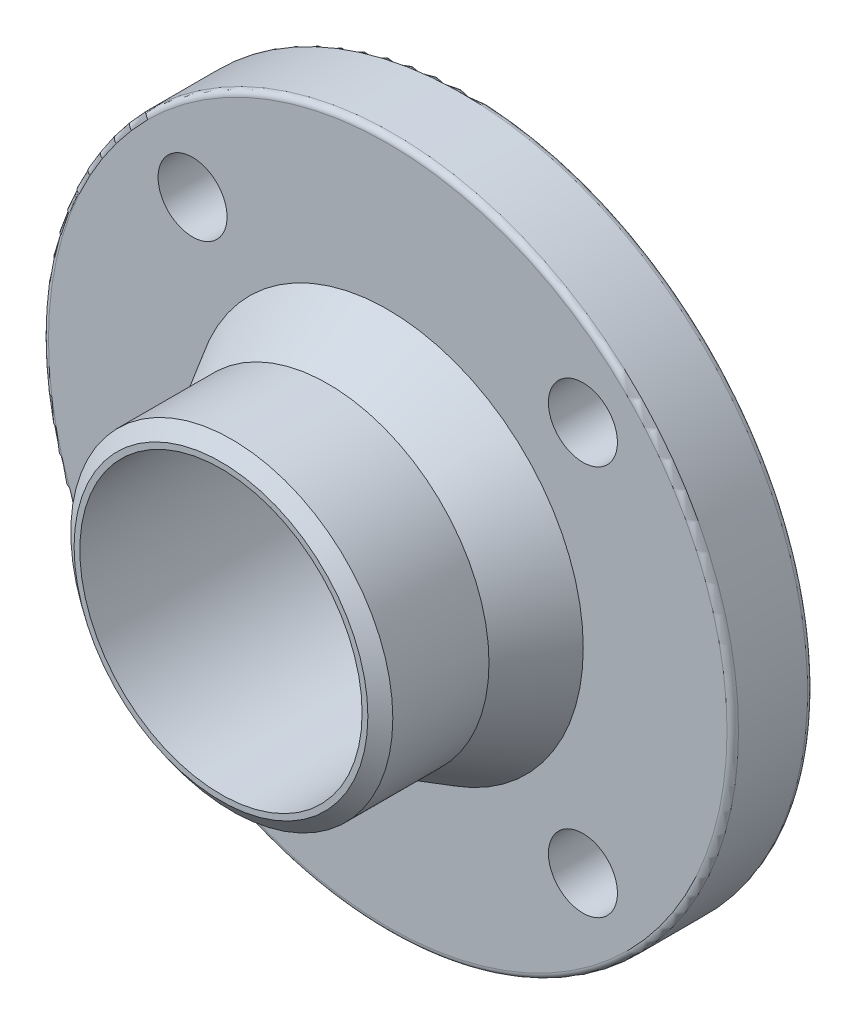
ISO-10303-21;
HEADER;
FILE_DESCRIPTION(('STEP AP214'),'2;1');
FILE_NAME('part.step','',(''),(''),'','','');
FILE_SCHEMA(('AUTOMOTIVE_DESIGN { 1 0 10303 214 1 1 1 1 }'));
ENDSEC;
DATA;
#1=APPLICATION_CONTEXT('core data for automotive mechanical design processes');
#2=APPLICATION_PROTOCOL_DEFINITION('international standard','automotive_design',2000,#1);
#3=PRODUCT_CONTEXT('',#1,'mechanical');
#4=PRODUCT('Part','Part','',(#3));
#5=PRODUCT_RELATED_PRODUCT_CATEGORY('part','',(#4));
#6=PRODUCT_DEFINITION_FORMATION('','',#4);
#7=PRODUCT_DEFINITION_CONTEXT('part definition',#1,'design');
#8=PRODUCT_DEFINITION('design','',#6,#7);
#9=PRODUCT_DEFINITION_SHAPE('','',#8);
#10=(LENGTH_UNIT() NAMED_UNIT(*) SI_UNIT(.MILLI.,.METRE.));
#11=(NAMED_UNIT(*) PLANE_ANGLE_UNIT() SI_UNIT($,.RADIAN.));
#12=(NAMED_UNIT(*) SI_UNIT($,.STERADIAN.) SOLID_ANGLE_UNIT());
#13=UNCERTAINTY_MEASURE_WITH_UNIT(LENGTH_MEASURE(1.E-05),#10,'distance_accuracy_value','');
#14=(GEOMETRIC_REPRESENTATION_CONTEXT(3) GLOBAL_UNCERTAINTY_ASSIGNED_CONTEXT((#13)) GLOBAL_UNIT_ASSIGNED_CONTEXT((#10,
#11,#12)) REPRESENTATION_CONTEXT('',''));
#15=CARTESIAN_POINT('',(0.,0.,0.));
#16=DIRECTION('',(0.,0.,1.));
#17=DIRECTION('',(1.,0.,0.));
#18=AXIS2_PLACEMENT_3D('',#15,#16,#17);
#19=CARTESIAN_POINT('',(0.,0.,0.));
#20=DIRECTION('',(0.,0.,1.));
#21=DIRECTION('',(1.,0.,0.));
#22=AXIS2_PLACEMENT_3D('',#19,#20,#21);
#23=PLANE('',#22);
#24=CARTESIAN_POINT('',(0.,0.,0.));
#25=DIRECTION('',(0.,0.,-1.));
#26=DIRECTION('',(-1.,0.,0.));
#27=AXIS2_PLACEMENT_3D('',#24,#25,#26);
#28=CIRCLE('',#27,63.5);
#29=CARTESIAN_POINT('',(-63.5,0.,0.));
#30=VERTEX_POINT('',#29);
#31=EDGE_CURVE('E84',#30,#30,#28,.T.);
#32=ORIENTED_EDGE('',*,*,#31,.T.);
#33=EDGE_LOOP('',(#32));
#34=FACE_BOUND('',#33,.T.);
#35=CARTESIAN_POINT('',(0.,0.,0.));
#36=DIRECTION('',(0.,0.,1.));
#37=DIRECTION('',(1.,0.,0.));
#38=AXIS2_PLACEMENT_3D('',#35,#36,#37);
#39=CIRCLE('',#38,38.9636);
#40=CARTESIAN_POINT('',(38.9636,0.,0.));
#41=VERTEX_POINT('',#40);
#42=EDGE_CURVE('E120',#41,#41,#39,.T.);
#43=ORIENTED_EDGE('',*,*,#42,.T.);
#44=EDGE_LOOP('',(#43));
#45=FACE_BOUND('',#44,.T.);
#46=ADVANCED_FACE('F39',(#34,#45),#23,.F.);
#47=CARTESIAN_POINT('',(0.,0.,69.85));
#48=DIRECTION('',(0.,0.,1.));
#49=DIRECTION('',(1.,0.,0.));
#50=AXIS2_PLACEMENT_3D('',#47,#48,#49);
#51=PLANE('',#50);
#52=CARTESIAN_POINT('',(0.,0.,69.85));
#53=DIRECTION('',(0.,0.,1.));
#54=DIRECTION('',(1.,0.,0.));
#55=AXIS2_PLACEMENT_3D('',#52,#53,#54);
#56=CIRCLE('',#55,40.5510999999567);
#57=CARTESIAN_POINT('',(40.5510999999567,0.,69.85));
#58=VERTEX_POINT('',#57);
#59=EDGE_CURVE('E74',#58,#58,#56,.T.);
#60=ORIENTED_EDGE('',*,*,#59,.T.);
#61=EDGE_LOOP('',(#60));
#62=FACE_BOUND('',#61,.T.);
#63=CARTESIAN_POINT('',(0.,0.,69.85));
#64=DIRECTION('',(0.,0.,1.));
#65=DIRECTION('',(1.,0.,0.));
#66=AXIS2_PLACEMENT_3D('',#63,#64,#65);
#67=CIRCLE('',#66,38.9636);
#68=CARTESIAN_POINT('',(38.9636,0.,69.85));
#69=VERTEX_POINT('',#68);
#70=EDGE_CURVE('E119',#69,#69,#67,.T.);
#71=ORIENTED_EDGE('',*,*,#70,.F.);
#72=EDGE_LOOP('',(#71));
#73=FACE_BOUND('',#72,.T.);
#74=ADVANCED_FACE('F131',(#62,#73),#51,.T.);
#75=CARTESIAN_POINT('',(0.,0.,23.8125));
#76=DIRECTION('',(0.,0.,1.));
#77=DIRECTION('',(1.,0.,0.));
#78=AXIS2_PLACEMENT_3D('',#75,#76,#77);
#79=PLANE('',#78);
#80=CARTESIAN_POINT('',(0.,0.,23.8125));
#81=DIRECTION('',(0.,0.,1.));
#82=DIRECTION('',(1.,0.,0.));
#83=AXIS2_PLACEMENT_3D('',#80,#81,#82);
#84=CIRCLE('',#83,93.6625);
#85=CARTESIAN_POINT('',(93.6625,0.,23.8125));
#86=VERTEX_POINT('',#85);
#87=EDGE_CURVE('E47',#86,#86,#84,.T.);
#88=ORIENTED_EDGE('',*,*,#87,.T.);
#89=EDGE_LOOP('',(#88));
#90=FACE_BOUND('',#89,.T.);
#91=CARTESIAN_POINT('',(53.8815367264154,-53.8815367264144,23.8125));
#92=DIRECTION('',(0.,0.,1.));
#93=DIRECTION('',(0.,-1.,0.));
#94=AXIS2_PLACEMENT_3D('',#91,#92,#93);
#95=CIRCLE('',#94,9.52500000000001);
#96=CARTESIAN_POINT('',(53.8815367264155,-63.4065367264144,23.8125));
#97=VERTEX_POINT('',#96);
#98=EDGE_CURVE('E95',#97,#97,#95,.T.);
#99=ORIENTED_EDGE('',*,*,#98,.F.);
#100=EDGE_LOOP('',(#99));
#101=FACE_BOUND('',#100,.T.);
#102=CARTESIAN_POINT('',(-53.881536726415,53.8815367264148,23.8125));
#103=DIRECTION('',(0.,0.,1.));
#104=DIRECTION('',(0.,1.,0.));
#105=AXIS2_PLACEMENT_3D('',#102,#103,#104);
#106=CIRCLE('',#105,9.52500000000001);
#107=CARTESIAN_POINT('',(-53.8815367264151,63.4065367264148,23.8125));
#108=VERTEX_POINT('',#107);
#109=EDGE_CURVE('E88',#108,#108,#106,.T.);
#110=ORIENTED_EDGE('',*,*,#109,.F.);
#111=EDGE_LOOP('',(#110));
#112=FACE_BOUND('',#111,.T.);
#113=CARTESIAN_POINT('',(53.881536726415,53.8815367264149,23.8125));
#114=DIRECTION('',(0.,0.,1.));
#115=DIRECTION('',(1.,0.,0.));
#116=AXIS2_PLACEMENT_3D('',#113,#114,#115);
#117=CIRCLE('',#116,9.52500000000001);
#118=CARTESIAN_POINT('',(63.406536726415,53.8815367264149,23.8125));
#119=VERTEX_POINT('',#118);
#120=EDGE_CURVE('E78',#119,#119,#117,.T.);
#121=ORIENTED_EDGE('',*,*,#120,.F.);
#122=EDGE_LOOP('',(#121));
#123=FACE_BOUND('',#122,.T.);
#124=CARTESIAN_POINT('',(-53.881536726415,-53.8815367264149,23.8125));
#125=DIRECTION('',(0.,0.,1.));
#126=DIRECTION('',(-1.,0.,0.));
#127=AXIS2_PLACEMENT_3D('',#124,#125,#126);
#128=CIRCLE('',#127,9.52500000000001);
#129=CARTESIAN_POINT('',(-63.406536726415,-53.8815367264149,23.8125));
#130=VERTEX_POINT('',#129);
#131=EDGE_CURVE('E91',#130,#130,#128,.T.);
#132=ORIENTED_EDGE('',*,*,#131,.F.);
#133=EDGE_LOOP('',(#132));
#134=FACE_BOUND('',#133,.T.);
#135=CARTESIAN_POINT('',(0.,0.,23.8125));
#136=DIRECTION('',(0.,0.,1.));
#137=DIRECTION('',(1.,0.,0.));
#138=AXIS2_PLACEMENT_3D('',#135,#136,#137);
#139=CIRCLE('',#138,53.975);
#140=CARTESIAN_POINT('',(53.975,0.,23.8125));
#141=VERTEX_POINT('',#140);
#142=EDGE_CURVE('E112',#141,#141,#139,.T.);
#143=ORIENTED_EDGE('',*,*,#142,.F.);
#144=EDGE_LOOP('',(#143));
#145=FACE_BOUND('',#144,.T.);
#146=ADVANCED_FACE('F133',(#90,#101,#112,#123,#134,#145),#79,.T.);
#147=CARTESIAN_POINT('',(0.,0.,23.8125));
#148=DIRECTION('',(0.,0.,-1.));
#149=DIRECTION('',(-1.,0.,0.));
#150=AXIS2_PLACEMENT_3D('',#147,#148,#149);
#151=CYLINDRICAL_SURFACE('',#150,95.25);
#152=CARTESIAN_POINT('',(0.,0.,3.175));
#153=DIRECTION('',(0.,0.,-1.));
#154=DIRECTION('',(-1.,0.,0.));
#155=AXIS2_PLACEMENT_3D('',#152,#153,#154);
#156=CIRCLE('',#155,95.25);
#157=CARTESIAN_POINT('',(-95.25,0.,3.175));
#158=VERTEX_POINT('',#157);
#159=EDGE_CURVE('E54',#158,#158,#156,.F.);
#160=ORIENTED_EDGE('',*,*,#159,.T.);
#161=EDGE_LOOP('',(#160));
#162=FACE_BOUND('',#161,.T.);
#163=CARTESIAN_POINT('',(0.,0.,22.225));
#164=DIRECTION('',(0.,0.,1.));
#165=DIRECTION('',(1.,0.,0.));
#166=AXIS2_PLACEMENT_3D('',#163,#164,#165);
#167=CIRCLE('',#166,95.25);
#168=CARTESIAN_POINT('',(95.25,0.,22.225));
#169=VERTEX_POINT('',#168);
#170=EDGE_CURVE('E61',#169,#169,#167,.F.);
#171=ORIENTED_EDGE('',*,*,#170,.T.);
#172=EDGE_LOOP('',(#171));
#173=FACE_BOUND('',#172,.T.);
#174=ADVANCED_FACE('F140',(#162,#173),#151,.T.);
#175=CARTESIAN_POINT('',(53.881536726415,53.8815367264149,23.8125));
#176=DIRECTION('',(0.,0.,-1.));
#177=DIRECTION('',(-1.,0.,0.));
#178=AXIS2_PLACEMENT_3D('',#175,#176,#177);
#179=CYLINDRICAL_SURFACE('',#178,9.52500000000001);
#180=ORIENTED_EDGE('',*,*,#120,.T.);
#181=EDGE_LOOP('',(#180));
#182=FACE_BOUND('',#181,.T.);
#183=CARTESIAN_POINT('',(53.881536726415,53.8815367264149,1.5875));
#184=DIRECTION('',(0.,0.,-1.));
#185=DIRECTION('',(-1.,0.,0.));
#186=AXIS2_PLACEMENT_3D('',#183,#184,#185);
#187=CIRCLE('',#186,9.52500000000001);
#188=CARTESIAN_POINT('',(44.356536726415,53.8815367264149,1.5875));
#189=VERTEX_POINT('',#188);
#190=EDGE_CURVE('E99',#189,#189,#187,.T.);
#191=ORIENTED_EDGE('',*,*,#190,.T.);
#192=EDGE_LOOP('',(#191));
#193=FACE_BOUND('',#192,.T.);
#194=ADVANCED_FACE('F162',(#182,#193),#179,.F.);
#195=CARTESIAN_POINT('',(-53.881536726415,53.8815367264148,23.8125));
#196=DIRECTION('',(0.,0.,-1.));
#197=DIRECTION('',(-1.,0.,0.));
#198=AXIS2_PLACEMENT_3D('',#195,#196,#197);
#199=CYLINDRICAL_SURFACE('',#198,9.52500000000001);
#200=ORIENTED_EDGE('',*,*,#109,.T.);
#201=EDGE_LOOP('',(#200));
#202=FACE_BOUND('',#201,.T.);
#203=CARTESIAN_POINT('',(-53.881536726415,53.8815367264148,1.5875));
#204=DIRECTION('',(0.,0.,-1.));
#205=DIRECTION('',(-1.,0.,0.));
#206=AXIS2_PLACEMENT_3D('',#203,#204,#205);
#207=CIRCLE('',#206,9.52500000000001);
#208=CARTESIAN_POINT('',(-63.4065367264151,53.8815367264148,1.5875));
#209=VERTEX_POINT('',#208);
#210=EDGE_CURVE('E103',#209,#209,#207,.T.);
#211=ORIENTED_EDGE('',*,*,#210,.T.);
#212=EDGE_LOOP('',(#211));
#213=FACE_BOUND('',#212,.T.);
#214=ADVANCED_FACE('F158',(#202,#213),#199,.F.);
#215=CARTESIAN_POINT('',(-53.881536726415,-53.8815367264149,23.8125));
#216=DIRECTION('',(0.,0.,-1.));
#217=DIRECTION('',(-1.,0.,0.));
#218=AXIS2_PLACEMENT_3D('',#215,#216,#217);
#219=CYLINDRICAL_SURFACE('',#218,9.52500000000001);
#220=ORIENTED_EDGE('',*,*,#131,.T.);
#221=EDGE_LOOP('',(#220));
#222=FACE_BOUND('',#221,.T.);
#223=CARTESIAN_POINT('',(-53.881536726415,-53.8815367264149,1.5875));
#224=DIRECTION('',(0.,0.,-1.));
#225=DIRECTION('',(-1.,0.,0.));
#226=AXIS2_PLACEMENT_3D('',#223,#224,#225);
#227=CIRCLE('',#226,9.52500000000001);
#228=CARTESIAN_POINT('',(-63.406536726415,-53.8815367264149,1.5875));
#229=VERTEX_POINT('',#228);
#230=EDGE_CURVE('E83',#229,#229,#227,.T.);
#231=ORIENTED_EDGE('',*,*,#230,.T.);
#232=EDGE_LOOP('',(#231));
#233=FACE_BOUND('',#232,.T.);
#234=ADVANCED_FACE('F154',(#222,#233),#219,.F.);
#235=CARTESIAN_POINT('',(53.8815367264154,-53.8815367264144,23.8125));
#236=DIRECTION('',(0.,0.,-1.));
#237=DIRECTION('',(-1.,0.,0.));
#238=AXIS2_PLACEMENT_3D('',#235,#236,#237);
#239=CYLINDRICAL_SURFACE('',#238,9.52500000000001);
#240=ORIENTED_EDGE('',*,*,#98,.T.);
#241=EDGE_LOOP('',(#240));
#242=FACE_BOUND('',#241,.T.);
#243=CARTESIAN_POINT('',(53.8815367264154,-53.8815367264144,1.5875));
#244=DIRECTION('',(0.,0.,-1.));
#245=DIRECTION('',(-1.,0.,0.));
#246=AXIS2_PLACEMENT_3D('',#243,#244,#245);
#247=CIRCLE('',#246,9.52500000000001);
#248=CARTESIAN_POINT('',(44.3565367264154,-53.8815367264144,1.5875));
#249=VERTEX_POINT('',#248);
#250=EDGE_CURVE('E79',#249,#249,#247,.T.);
#251=ORIENTED_EDGE('',*,*,#250,.T.);
#252=EDGE_LOOP('',(#251));
#253=FACE_BOUND('',#252,.T.);
#254=ADVANCED_FACE('F151',(#242,#253),#239,.F.);
#255=CARTESIAN_POINT('',(0.,0.,1.5875));
#256=DIRECTION('',(0.,0.,-1.));
#257=DIRECTION('',(-1.,0.,0.));
#258=AXIS2_PLACEMENT_3D('',#255,#256,#257);
#259=PLANE('',#258);
#260=CARTESIAN_POINT('',(0.,0.,1.5875));
#261=DIRECTION('',(0.,0.,-1.));
#262=DIRECTION('',(-1.,0.,0.));
#263=AXIS2_PLACEMENT_3D('',#260,#261,#262);
#264=CIRCLE('',#263,65.0875);
#265=CARTESIAN_POINT('',(-65.0875,0.,1.5875));
#266=VERTEX_POINT('',#265);
#267=EDGE_CURVE('E11',#266,#266,#264,.F.);
#268=ORIENTED_EDGE('',*,*,#267,.T.);
#269=EDGE_LOOP('',(#268));
#270=FACE_BOUND('',#269,.T.);
#271=CARTESIAN_POINT('',(0.,0.,1.5875));
#272=DIRECTION('',(0.,0.,-1.));
#273=DIRECTION('',(-1.,0.,0.));
#274=AXIS2_PLACEMENT_3D('',#271,#272,#273);
#275=CIRCLE('',#274,93.6625);
#276=CARTESIAN_POINT('',(-93.6625,0.,1.5875));
#277=VERTEX_POINT('',#276);
#278=EDGE_CURVE('E66',#277,#277,#275,.T.);
#279=ORIENTED_EDGE('',*,*,#278,.T.);
#280=EDGE_LOOP('',(#279));
#281=FACE_BOUND('',#280,.T.);
#282=ORIENTED_EDGE('',*,*,#250,.F.);
#283=EDGE_LOOP('',(#282));
#284=FACE_BOUND('',#283,.T.);
#285=ORIENTED_EDGE('',*,*,#230,.F.);
#286=EDGE_LOOP('',(#285));
#287=FACE_BOUND('',#286,.T.);
#288=ORIENTED_EDGE('',*,*,#210,.F.);
#289=EDGE_LOOP('',(#288));
#290=FACE_BOUND('',#289,.T.);
#291=ORIENTED_EDGE('',*,*,#190,.F.);
#292=EDGE_LOOP('',(#291));
#293=FACE_BOUND('',#292,.T.);
#294=ADVANCED_FACE('F148',(#270,#281,#284,#287,#290,#293),#259,.T.);
#295=CARTESIAN_POINT('',(0.,0.,23.8125));
#296=DIRECTION('',(0.,0.,-1.));
#297=DIRECTION('',(1.,0.,0.));
#298=AXIS2_PLACEMENT_3D('',#295,#296,#297);
#299=CONICAL_SURFACE('',#298,53.975,0.5235987755983);
#300=CARTESIAN_POINT('',(0.,0.,40.3102839420935));
#301=DIRECTION('',(0.,0.,-1.));
#302=DIRECTION('',(-1.,0.,0.));
#303=AXIS2_PLACEMENT_3D('',#300,#301,#302);
#304=CIRCLE('',#303,44.45);
#305=CARTESIAN_POINT('',(-44.45,0.,40.3102839420935));
#306=VERTEX_POINT('',#305);
#307=EDGE_CURVE('E115',#306,#306,#304,.F.);
#308=ORIENTED_EDGE('',*,*,#307,.F.);
#309=EDGE_LOOP('',(#308));
#310=FACE_BOUND('',#309,.T.);
#311=ORIENTED_EDGE('',*,*,#142,.T.);
#312=EDGE_LOOP('',(#311));
#313=FACE_BOUND('',#312,.T.);
#314=ADVANCED_FACE('F146',(#310,#313),#299,.T.);
#315=CARTESIAN_POINT('',(0.,0.,-500000.));
#316=DIRECTION('',(0.,0.,1.));
#317=DIRECTION('',(1.,0.,0.));
#318=AXIS2_PLACEMENT_3D('',#315,#316,#317);
#319=CYLINDRICAL_SURFACE('',#318,44.45);
#320=CARTESIAN_POINT('',(0.,0.,66.858268806584));
#321=DIRECTION('',(0.,0.,1.));
#322=DIRECTION('',(1.,0.,0.));
#323=AXIS2_PLACEMENT_3D('',#320,#321,#322);
#324=CIRCLE('',#323,44.45);
#325=CARTESIAN_POINT('',(44.45,0.,66.858268806584));
#326=VERTEX_POINT('',#325);
#327=EDGE_CURVE('E70',#326,#326,#324,.F.);
#328=ORIENTED_EDGE('',*,*,#327,.T.);
#329=EDGE_LOOP('',(#328));
#330=FACE_BOUND('',#329,.T.);
#331=ORIENTED_EDGE('',*,*,#307,.T.);
#332=EDGE_LOOP('',(#331));
#333=FACE_BOUND('',#332,.T.);
#334=ADVANCED_FACE('F173',(#330,#333),#319,.T.);
#335=CARTESIAN_POINT('',(0.,0.,69.849999999974));
#336=DIRECTION('',(0.,0.,-1.));
#337=DIRECTION('',(-1.,0.,0.));
#338=AXIS2_PLACEMENT_3D('',#335,#336,#337);
#339=CONICAL_SURFACE('',#338,40.5510999999906,0.916297857304829);
#340=ORIENTED_EDGE('',*,*,#327,.F.);
#341=EDGE_LOOP('',(#340));
#342=FACE_BOUND('',#341,.T.);
#343=ORIENTED_EDGE('',*,*,#59,.F.);
#344=EDGE_LOOP('',(#343));
#345=FACE_BOUND('',#344,.T.);
#346=ADVANCED_FACE('F170',(#342,#345),#339,.T.);
#347=CARTESIAN_POINT('',(0.,0.,69.85));
#348=DIRECTION('',(0.,0.,-1.));
#349=DIRECTION('',(-1.,0.,0.));
#350=AXIS2_PLACEMENT_3D('',#347,#348,#349);
#351=CYLINDRICAL_SURFACE('',#350,38.9636);
#352=ORIENTED_EDGE('',*,*,#70,.T.);
#353=EDGE_LOOP('',(#352));
#354=FACE_BOUND('',#353,.T.);
#355=ORIENTED_EDGE('',*,*,#42,.F.);
#356=EDGE_LOOP('',(#355));
#357=FACE_BOUND('',#356,.T.);
#358=ADVANCED_FACE('F128',(#354,#357),#351,.F.);
#359=CARTESIAN_POINT('',(0.,0.,3.175));
#360=DIRECTION('',(0.,0.,-1.));
#361=DIRECTION('',(-1.,0.,0.));
#362=AXIS2_PLACEMENT_3D('',#359,#360,#361);
#363=TOROIDAL_SURFACE('',#362,93.6625,1.5875);
#364=ORIENTED_EDGE('',*,*,#159,.F.);
#365=EDGE_LOOP('',(#364));
#366=FACE_BOUND('',#365,.T.);
#367=ORIENTED_EDGE('',*,*,#278,.F.);
#368=EDGE_LOOP('',(#367));
#369=FACE_BOUND('',#368,.T.);
#370=ADVANCED_FACE('F175',(#366,#369),#363,.T.);
#371=CARTESIAN_POINT('',(0.,0.,22.225));
#372=DIRECTION('',(0.,0.,1.));
#373=DIRECTION('',(1.,0.,0.));
#374=AXIS2_PLACEMENT_3D('',#371,#372,#373);
#375=TOROIDAL_SURFACE('',#374,93.6625,1.5875);
#376=ORIENTED_EDGE('',*,*,#170,.F.);
#377=EDGE_LOOP('',(#376));
#378=FACE_BOUND('',#377,.T.);
#379=ORIENTED_EDGE('',*,*,#87,.F.);
#380=EDGE_LOOP('',(#379));
#381=FACE_BOUND('',#380,.T.);
#382=ADVANCED_FACE('F177',(#378,#381),#375,.T.);
#383=CARTESIAN_POINT('',(0.,0.,0.));
#384=DIRECTION('',(0.,0.,-1.));
#385=DIRECTION('',(-1.,0.,0.));
#386=AXIS2_PLACEMENT_3D('',#383,#384,#385);
#387=TOROIDAL_SURFACE('',#386,65.0875,1.5875);
#388=ORIENTED_EDGE('',*,*,#267,.F.);
#389=EDGE_LOOP('',(#388));
#390=FACE_BOUND('',#389,.T.);
#391=ORIENTED_EDGE('',*,*,#31,.F.);
#392=EDGE_LOOP('',(#391));
#393=FACE_BOUND('',#392,.T.);
#394=ADVANCED_FACE('F41',(#390,#393),#387,.F.);
#395=CLOSED_SHELL('',(#46,#74,#146,#174,#194,#214,#234,#254,#294,#314,#334,#346,#358,#370,#382,#394));
#396=MANIFOLD_SOLID_BREP('B2',#395);
#397=ADVANCED_BREP_SHAPE_REPRESENTATION('',(#18,#396),#14);
#398=SHAPE_DEFINITION_REPRESENTATION(#9,#397);
ENDSEC;
END-ISO-10303-21;
